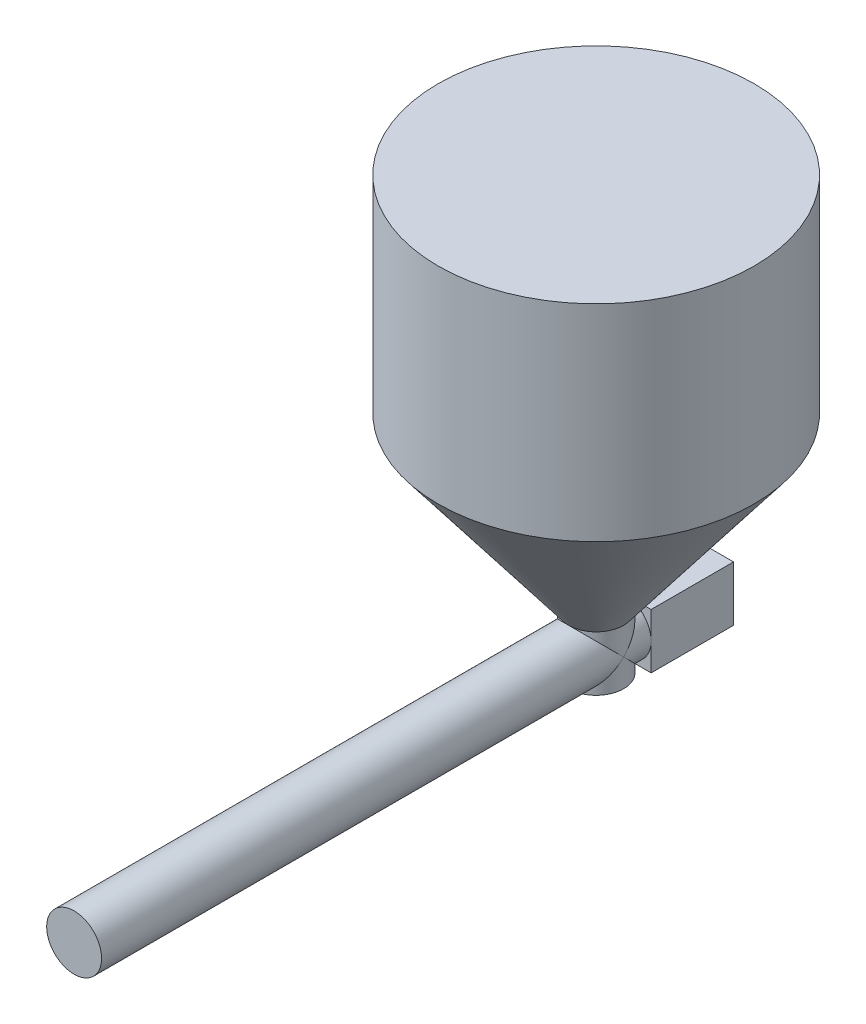
ISO-10303-21;
HEADER;
FILE_DESCRIPTION(('STEP AP214'),'2;1');
FILE_NAME('part.step','',(''),(''),'','','');
FILE_SCHEMA(('AUTOMOTIVE_DESIGN { 1 0 10303 214 1 1 1 1 }'));
ENDSEC;
DATA;
#1=APPLICATION_CONTEXT('core data for automotive mechanical design processes');
#2=APPLICATION_PROTOCOL_DEFINITION('international standard','automotive_design',2000,#1);
#3=PRODUCT_CONTEXT('',#1,'mechanical');
#4=PRODUCT('Part','Part','',(#3));
#5=PRODUCT_RELATED_PRODUCT_CATEGORY('part','',(#4));
#6=PRODUCT_DEFINITION_FORMATION('','',#4);
#7=PRODUCT_DEFINITION_CONTEXT('part definition',#1,'design');
#8=PRODUCT_DEFINITION('design','',#6,#7);
#9=PRODUCT_DEFINITION_SHAPE('','',#8);
#10=(LENGTH_UNIT() NAMED_UNIT(*) SI_UNIT(.MILLI.,.METRE.));
#11=(NAMED_UNIT(*) PLANE_ANGLE_UNIT() SI_UNIT($,.RADIAN.));
#12=(NAMED_UNIT(*) SI_UNIT($,.STERADIAN.) SOLID_ANGLE_UNIT());
#13=UNCERTAINTY_MEASURE_WITH_UNIT(LENGTH_MEASURE(1.E-05),#10,'distance_accuracy_value','');
#14=(GEOMETRIC_REPRESENTATION_CONTEXT(3) GLOBAL_UNCERTAINTY_ASSIGNED_CONTEXT((#13)) GLOBAL_UNIT_ASSIGNED_CONTEXT((#10,
#11,#12)) REPRESENTATION_CONTEXT('',''));
#15=CARTESIAN_POINT('',(0.,0.,0.));
#16=DIRECTION('',(0.,0.,1.));
#17=DIRECTION('',(1.,0.,0.));
#18=AXIS2_PLACEMENT_3D('',#15,#16,#17);
#19=CARTESIAN_POINT('',(0.,-314.,0.));
#20=DIRECTION('',(0.,1.,0.));
#21=DIRECTION('',(0.,0.,1.));
#22=AXIS2_PLACEMENT_3D('',#19,#20,#21);
#23=CYLINDRICAL_SURFACE('',#22,20.);
#24=CARTESIAN_POINT('',(0.,-294.,0.));
#25=DIRECTION('',(0.,0.707106781186547,-0.707106781186547));
#26=DIRECTION('',(0.,0.707106781186547,0.707106781186547));
#27=AXIS2_PLACEMENT_3D('',#24,#25,#26);
#28=ELLIPSE('',#27,28.2842712474619,20.);
#29=CARTESIAN_POINT('',(0.,-274.,20.));
#30=VERTEX_POINT('',#29);
#31=CARTESIAN_POINT('',(20.,-294.,0.));
#32=VERTEX_POINT('',#31);
#33=EDGE_CURVE('E207',#30,#32,#28,.T.);
#34=ORIENTED_EDGE('',*,*,#33,.T.);
#35=CARTESIAN_POINT('',(0.,-294.,0.));
#36=DIRECTION('',(0.,0.707106781186547,0.707106781186547));
#37=DIRECTION('',(0.,0.707106781186547,-0.707106781186547));
#38=AXIS2_PLACEMENT_3D('',#35,#36,#37);
#39=ELLIPSE('',#38,28.2842712474619,20.);
#40=CARTESIAN_POINT('',(0.,-274.,-20.));
#41=VERTEX_POINT('',#40);
#42=EDGE_CURVE('E202',#32,#41,#39,.T.);
#43=ORIENTED_EDGE('',*,*,#42,.T.);
#44=CARTESIAN_POINT('',(0.,-274.,0.));
#45=DIRECTION('',(0.,-1.,0.));
#46=DIRECTION('',(0.,0.,-1.));
#47=AXIS2_PLACEMENT_3D('',#44,#45,#46);
#48=CIRCLE('',#47,20.);
#49=EDGE_CURVE('E227',#41,#30,#48,.T.);
#50=ORIENTED_EDGE('',*,*,#49,.T.);
#51=EDGE_LOOP('',(#34,#43,#50));
#52=FACE_BOUND('',#51,.T.);
#53=ADVANCED_FACE('F37',(#52),#23,.T.);
#54=CARTESIAN_POINT('',(0.,-150.,0.));
#55=DIRECTION('',(0.,1.,0.));
#56=DIRECTION('',(0.,0.,1.));
#57=AXIS2_PLACEMENT_3D('',#54,#55,#56);
#58=CYLINDRICAL_SURFACE('',#57,115.);
#59=CARTESIAN_POINT('',(0.,-150.,0.));
#60=DIRECTION('',(0.,-1.,0.));
#61=DIRECTION('',(0.,0.,-1.));
#62=AXIS2_PLACEMENT_3D('',#59,#60,#61);
#63=CIRCLE('',#62,115.);
#64=CARTESIAN_POINT('',(0.,-150.,-115.));
#65=VERTEX_POINT('',#64);
#66=EDGE_CURVE('E47',#65,#65,#63,.T.);
#67=ORIENTED_EDGE('',*,*,#66,.F.);
#68=EDGE_LOOP('',(#67));
#69=FACE_BOUND('',#68,.T.);
#70=CARTESIAN_POINT('',(0.,0.,0.));
#71=DIRECTION('',(0.,1.,0.));
#72=DIRECTION('',(0.,0.,1.));
#73=AXIS2_PLACEMENT_3D('',#70,#71,#72);
#74=CIRCLE('',#73,115.);
#75=CARTESIAN_POINT('',(0.,0.,115.));
#76=VERTEX_POINT('',#75);
#77=EDGE_CURVE('E12',#76,#76,#74,.T.);
#78=ORIENTED_EDGE('',*,*,#77,.F.);
#79=EDGE_LOOP('',(#78));
#80=FACE_BOUND('',#79,.T.);
#81=ADVANCED_FACE('F39',(#69,#80),#58,.T.);
#82=CARTESIAN_POINT('',(0.,0.,0.));
#83=DIRECTION('',(0.,1.,0.));
#84=DIRECTION('',(0.,0.,1.));
#85=AXIS2_PLACEMENT_3D('',#82,#83,#84);
#86=PLANE('',#85);
#87=ORIENTED_EDGE('',*,*,#77,.T.);
#88=EDGE_LOOP('',(#87));
#89=FACE_BOUND('',#88,.T.);
#90=ADVANCED_FACE('F243',(#89),#86,.T.);
#91=CARTESIAN_POINT('',(0.,-274.,0.));
#92=DIRECTION('',(0.,1.,0.));
#93=DIRECTION('',(0.,0.,1.));
#94=AXIS2_PLACEMENT_3D('',#91,#92,#93);
#95=CONICAL_SURFACE('',#94,20.,0.65374402840699);
#96=ORIENTED_EDGE('',*,*,#49,.F.);
#97=CARTESIAN_POINT('',(0.,-274.,0.));
#98=DIRECTION('',(0.,-1.,0.));
#99=DIRECTION('',(0.,0.,1.));
#100=AXIS2_PLACEMENT_3D('',#97,#98,#99);
#101=CIRCLE('',#100,20.);
#102=EDGE_CURVE('E277',#30,#41,#101,.T.);
#103=ORIENTED_EDGE('',*,*,#102,.F.);
#104=EDGE_LOOP('',(#96,#103));
#105=FACE_BOUND('',#104,.T.);
#106=ORIENTED_EDGE('',*,*,#66,.T.);
#107=EDGE_LOOP('',(#106));
#108=FACE_BOUND('',#107,.T.);
#109=ADVANCED_FACE('F233',(#105,#108),#95,.T.);
#110=CARTESIAN_POINT('',(-20.,-294.,0.));
#111=VERTEX_POINT('',#110);
#112=EDGE_CURVE('E198',#41,#111,#39,.T.);
#113=ORIENTED_EDGE('',*,*,#112,.T.);
#114=EDGE_CURVE('E210',#111,#30,#28,.T.);
#115=ORIENTED_EDGE('',*,*,#114,.T.);
#116=ORIENTED_EDGE('',*,*,#102,.T.);
#117=EDGE_LOOP('',(#113,#115,#116));
#118=FACE_BOUND('',#117,.T.);
#119=ADVANCED_FACE('F242',(#118),#23,.T.);
#120=CARTESIAN_POINT('',(0.,-294.,380.));
#121=DIRECTION('',(0.,0.,-1.));
#122=DIRECTION('',(-1.,0.,0.));
#123=AXIS2_PLACEMENT_3D('',#120,#121,#122);
#124=PLANE('',#123);
#125=CARTESIAN_POINT('',(0.,-294.,380.));
#126=DIRECTION('',(0.,0.,-1.));
#127=DIRECTION('',(-1.,0.,0.));
#128=AXIS2_PLACEMENT_3D('',#125,#126,#127);
#129=CIRCLE('',#128,20.);
#130=CARTESIAN_POINT('',(-20.,-294.,380.));
#131=VERTEX_POINT('',#130);
#132=EDGE_CURVE('E188',#131,#131,#129,.T.);
#133=ORIENTED_EDGE('',*,*,#132,.F.);
#134=EDGE_LOOP('',(#133));
#135=FACE_BOUND('',#134,.T.);
#136=ADVANCED_FACE('F268',(#135),#124,.F.);
#137=CARTESIAN_POINT('',(0.,-294.,380.));
#138=DIRECTION('',(0.,0.,-1.));
#139=DIRECTION('',(-1.,0.,0.));
#140=AXIS2_PLACEMENT_3D('',#137,#138,#139);
#141=CYLINDRICAL_SURFACE('',#140,20.);
#142=ORIENTED_EDGE('',*,*,#132,.T.);
#143=EDGE_LOOP('',(#142));
#144=FACE_BOUND('',#143,.T.);
#145=CARTESIAN_POINT('',(0.,-294.,0.));
#146=DIRECTION('',(0.,0.707106781186547,0.707106781186547));
#147=DIRECTION('',(0.,0.707106781186547,-0.707106781186547));
#148=AXIS2_PLACEMENT_3D('',#145,#146,#147);
#149=ELLIPSE('',#148,28.2842712474619,20.);
#150=CARTESIAN_POINT('',(0.,-314.,20.));
#151=VERTEX_POINT('',#150);
#152=EDGE_CURVE('E199',#32,#151,#149,.F.);
#153=ORIENTED_EDGE('',*,*,#152,.F.);
#154=ORIENTED_EDGE('',*,*,#33,.F.);
#155=ORIENTED_EDGE('',*,*,#114,.F.);
#156=EDGE_CURVE('E63',#151,#111,#149,.F.);
#157=ORIENTED_EDGE('',*,*,#156,.F.);
#158=EDGE_LOOP('',(#153,#154,#155,#157));
#159=FACE_BOUND('',#158,.T.);
#160=ADVANCED_FACE('F273',(#144,#159),#141,.T.);
#161=CARTESIAN_POINT('',(0.,-294.,0.));
#162=DIRECTION('',(0.,0.707106781186547,-0.707106781186547));
#163=DIRECTION('',(0.,0.707106781186547,0.707106781186547));
#164=AXIS2_PLACEMENT_3D('',#161,#162,#163);
#165=ELLIPSE('',#164,28.2842712474619,20.);
#166=CARTESIAN_POINT('',(0.,-314.,-20.));
#167=VERTEX_POINT('',#166);
#168=EDGE_CURVE('E219',#111,#167,#165,.F.);
#169=ORIENTED_EDGE('',*,*,#168,.F.);
#170=ORIENTED_EDGE('',*,*,#112,.F.);
#171=CARTESIAN_POINT('',(0.,-294.,-20.));
#172=DIRECTION('',(0.,0.,-1.));
#173=DIRECTION('',(-1.,0.,0.));
#174=AXIS2_PLACEMENT_3D('',#171,#172,#173);
#175=CIRCLE('',#174,20.);
#176=CARTESIAN_POINT('',(-20.,-294.,-20.));
#177=VERTEX_POINT('',#176);
#178=EDGE_CURVE('E55',#41,#177,#175,.F.);
#179=ORIENTED_EDGE('',*,*,#178,.T.);
#180=CARTESIAN_POINT('',(0.,-294.,-20.));
#181=DIRECTION('',(0.,0.,-1.));
#182=DIRECTION('',(-1.,0.,0.));
#183=AXIS2_PLACEMENT_3D('',#180,#181,#182);
#184=CIRCLE('',#183,20.);
#185=EDGE_CURVE('E176',#167,#177,#184,.T.);
#186=ORIENTED_EDGE('',*,*,#185,.F.);
#187=EDGE_LOOP('',(#169,#170,#179,#186));
#188=FACE_BOUND('',#187,.T.);
#189=ADVANCED_FACE('F278',(#188),#141,.T.);
#190=EDGE_CURVE('E216',#167,#32,#165,.F.);
#191=ORIENTED_EDGE('',*,*,#190,.F.);
#192=CARTESIAN_POINT('',(0.,-294.,-20.));
#193=DIRECTION('',(0.,0.,-1.));
#194=DIRECTION('',(-1.,0.,0.));
#195=AXIS2_PLACEMENT_3D('',#192,#193,#194);
#196=CIRCLE('',#195,20.);
#197=CARTESIAN_POINT('',(20.,-294.,-20.));
#198=VERTEX_POINT('',#197);
#199=EDGE_CURVE('E134',#167,#198,#196,.F.);
#200=ORIENTED_EDGE('',*,*,#199,.T.);
#201=EDGE_CURVE('E178',#41,#198,#184,.T.);
#202=ORIENTED_EDGE('',*,*,#201,.F.);
#203=ORIENTED_EDGE('',*,*,#42,.F.);
#204=EDGE_LOOP('',(#191,#200,#202,#203));
#205=FACE_BOUND('',#204,.T.);
#206=ADVANCED_FACE('F265',(#205),#141,.T.);
#207=CARTESIAN_POINT('',(0.,-314.,0.));
#208=DIRECTION('',(0.,-1.,0.));
#209=DIRECTION('',(0.,0.,-1.));
#210=AXIS2_PLACEMENT_3D('',#207,#208,#209);
#211=PLANE('',#210);
#212=CARTESIAN_POINT('',(0.,-314.,0.));
#213=DIRECTION('',(0.,-1.,0.));
#214=DIRECTION('',(0.,0.,-1.));
#215=AXIS2_PLACEMENT_3D('',#212,#213,#214);
#216=CIRCLE('',#215,20.);
#217=EDGE_CURVE('E223',#151,#167,#216,.T.);
#218=ORIENTED_EDGE('',*,*,#217,.T.);
#219=EDGE_CURVE('E220',#167,#151,#216,.T.);
#220=ORIENTED_EDGE('',*,*,#219,.T.);
#221=EDGE_LOOP('',(#218,#220));
#222=FACE_BOUND('',#221,.T.);
#223=ADVANCED_FACE('F261',(#222),#211,.T.);
#224=ORIENTED_EDGE('',*,*,#156,.T.);
#225=ORIENTED_EDGE('',*,*,#168,.T.);
#226=ORIENTED_EDGE('',*,*,#217,.F.);
#227=EDGE_LOOP('',(#224,#225,#226));
#228=FACE_BOUND('',#227,.T.);
#229=ADVANCED_FACE('F255',(#228),#23,.T.);
#230=ORIENTED_EDGE('',*,*,#190,.T.);
#231=ORIENTED_EDGE('',*,*,#152,.T.);
#232=ORIENTED_EDGE('',*,*,#219,.F.);
#233=EDGE_LOOP('',(#230,#231,#232));
#234=FACE_BOUND('',#233,.T.);
#235=ADVANCED_FACE('F254',(#234),#23,.T.);
#236=CARTESIAN_POINT('',(0.,0.,-20.));
#237=DIRECTION('',(0.,0.,-1.));
#238=DIRECTION('',(-1.,0.,0.));
#239=AXIS2_PLACEMENT_3D('',#236,#237,#238);
#240=PLANE('',#239);
#241=ORIENTED_EDGE('',*,*,#185,.T.);
#242=DIRECTION('',(0.,1.,0.));
#243=VECTOR('',#242,1.);
#244=CARTESIAN_POINT('',(-20.,-274.,-20.));
#245=LINE('',#244,#243);
#246=CARTESIAN_POINT('',(-20.,-314.,-20.));
#247=VERTEX_POINT('',#246);
#248=EDGE_CURVE('E145',#247,#177,#245,.T.);
#249=ORIENTED_EDGE('',*,*,#248,.F.);
#250=DIRECTION('',(-1.,0.,0.));
#251=VECTOR('',#250,1.);
#252=CARTESIAN_POINT('',(20.,-314.,-20.));
#253=LINE('',#252,#251);
#254=EDGE_CURVE('E154',#167,#247,#253,.T.);
#255=ORIENTED_EDGE('',*,*,#254,.F.);
#256=EDGE_LOOP('',(#241,#249,#255));
#257=FACE_BOUND('',#256,.T.);
#258=ADVANCED_FACE('F175',(#257),#240,.F.);
#259=ORIENTED_EDGE('',*,*,#178,.F.);
#260=DIRECTION('',(1.,0.,0.));
#261=VECTOR('',#260,1.);
#262=CARTESIAN_POINT('',(20.,-274.,-20.));
#263=LINE('',#262,#261);
#264=CARTESIAN_POINT('',(-20.,-274.,-20.));
#265=VERTEX_POINT('',#264);
#266=EDGE_CURVE('E144',#265,#41,#263,.T.);
#267=ORIENTED_EDGE('',*,*,#266,.F.);
#268=EDGE_CURVE('E132',#177,#265,#245,.T.);
#269=ORIENTED_EDGE('',*,*,#268,.F.);
#270=EDGE_LOOP('',(#259,#267,#269));
#271=FACE_BOUND('',#270,.T.);
#272=ADVANCED_FACE('F181',(#271),#240,.F.);
#273=ORIENTED_EDGE('',*,*,#199,.F.);
#274=CARTESIAN_POINT('',(20.,-314.,-20.));
#275=VERTEX_POINT('',#274);
#276=EDGE_CURVE('E127',#275,#167,#253,.T.);
#277=ORIENTED_EDGE('',*,*,#276,.F.);
#278=DIRECTION('',(0.,-1.,0.));
#279=VECTOR('',#278,1.);
#280=CARTESIAN_POINT('',(20.,-274.,-20.));
#281=LINE('',#280,#279);
#282=EDGE_CURVE('E155',#198,#275,#281,.T.);
#283=ORIENTED_EDGE('',*,*,#282,.F.);
#284=EDGE_LOOP('',(#273,#277,#283));
#285=FACE_BOUND('',#284,.T.);
#286=ADVANCED_FACE('F168',(#285),#240,.F.);
#287=CARTESIAN_POINT('',(-20.,-274.,-80.));
#288=DIRECTION('',(1.,0.,0.));
#289=DIRECTION('',(0.,1.,0.));
#290=AXIS2_PLACEMENT_3D('',#287,#288,#289);
#291=PLANE('',#290);
#292=ORIENTED_EDGE('',*,*,#248,.T.);
#293=ORIENTED_EDGE('',*,*,#268,.T.);
#294=DIRECTION('',(0.,0.,1.));
#295=VECTOR('',#294,1.);
#296=CARTESIAN_POINT('',(-20.,-274.,-80.));
#297=LINE('',#296,#295);
#298=CARTESIAN_POINT('',(-20.,-274.,-80.));
#299=VERTEX_POINT('',#298);
#300=EDGE_CURVE('E112',#299,#265,#297,.T.);
#301=ORIENTED_EDGE('',*,*,#300,.F.);
#302=DIRECTION('',(0.,1.,0.));
#303=VECTOR('',#302,1.);
#304=CARTESIAN_POINT('',(-20.,-274.,-80.));
#305=LINE('',#304,#303);
#306=CARTESIAN_POINT('',(-20.,-314.,-80.));
#307=VERTEX_POINT('',#306);
#308=EDGE_CURVE('E118',#307,#299,#305,.T.);
#309=ORIENTED_EDGE('',*,*,#308,.F.);
#310=DIRECTION('',(0.,0.,1.));
#311=VECTOR('',#310,1.);
#312=CARTESIAN_POINT('',(-20.,-314.,-80.));
#313=LINE('',#312,#311);
#314=EDGE_CURVE('E158',#307,#247,#313,.T.);
#315=ORIENTED_EDGE('',*,*,#314,.T.);
#316=EDGE_LOOP('',(#292,#293,#301,#309,#315));
#317=FACE_BOUND('',#316,.T.);
#318=ADVANCED_FACE('F130',(#317),#291,.F.);
#319=CARTESIAN_POINT('',(20.,-274.,-80.));
#320=DIRECTION('',(0.,-1.,0.));
#321=DIRECTION('',(0.,0.,-1.));
#322=AXIS2_PLACEMENT_3D('',#319,#320,#321);
#323=PLANE('',#322);
#324=ORIENTED_EDGE('',*,*,#266,.T.);
#325=CARTESIAN_POINT('',(20.,-274.,-20.));
#326=VERTEX_POINT('',#325);
#327=EDGE_CURVE('E141',#41,#326,#263,.T.);
#328=ORIENTED_EDGE('',*,*,#327,.T.);
#329=DIRECTION('',(0.,0.,1.));
#330=VECTOR('',#329,1.);
#331=CARTESIAN_POINT('',(20.,-274.,-80.));
#332=LINE('',#331,#330);
#333=CARTESIAN_POINT('',(20.,-274.,-80.));
#334=VERTEX_POINT('',#333);
#335=EDGE_CURVE('E114',#334,#326,#332,.T.);
#336=ORIENTED_EDGE('',*,*,#335,.F.);
#337=DIRECTION('',(1.,0.,0.));
#338=VECTOR('',#337,1.);
#339=CARTESIAN_POINT('',(20.,-274.,-80.));
#340=LINE('',#339,#338);
#341=EDGE_CURVE('E107',#299,#334,#340,.T.);
#342=ORIENTED_EDGE('',*,*,#341,.F.);
#343=ORIENTED_EDGE('',*,*,#300,.T.);
#344=EDGE_LOOP('',(#324,#328,#336,#342,#343));
#345=FACE_BOUND('',#344,.T.);
#346=ADVANCED_FACE('F110',(#345),#323,.F.);
#347=CARTESIAN_POINT('',(20.,-274.,-80.));
#348=DIRECTION('',(-1.,0.,0.));
#349=DIRECTION('',(0.,-1.,0.));
#350=AXIS2_PLACEMENT_3D('',#347,#348,#349);
#351=PLANE('',#350);
#352=EDGE_CURVE('E150',#326,#198,#281,.T.);
#353=ORIENTED_EDGE('',*,*,#352,.T.);
#354=ORIENTED_EDGE('',*,*,#282,.T.);
#355=DIRECTION('',(0.,0.,1.));
#356=VECTOR('',#355,1.);
#357=CARTESIAN_POINT('',(20.,-314.,-80.));
#358=LINE('',#357,#356);
#359=CARTESIAN_POINT('',(20.,-314.,-80.));
#360=VERTEX_POINT('',#359);
#361=EDGE_CURVE('E137',#360,#275,#358,.T.);
#362=ORIENTED_EDGE('',*,*,#361,.F.);
#363=DIRECTION('',(0.,-1.,0.));
#364=VECTOR('',#363,1.);
#365=CARTESIAN_POINT('',(20.,-274.,-80.));
#366=LINE('',#365,#364);
#367=EDGE_CURVE('E117',#334,#360,#366,.T.);
#368=ORIENTED_EDGE('',*,*,#367,.F.);
#369=ORIENTED_EDGE('',*,*,#335,.T.);
#370=EDGE_LOOP('',(#353,#354,#362,#368,#369));
#371=FACE_BOUND('',#370,.T.);
#372=ADVANCED_FACE('F183',(#371),#351,.F.);
#373=CARTESIAN_POINT('',(20.,-314.,-80.));
#374=DIRECTION('',(0.,1.,0.));
#375=DIRECTION('',(0.,0.,1.));
#376=AXIS2_PLACEMENT_3D('',#373,#374,#375);
#377=PLANE('',#376);
#378=ORIENTED_EDGE('',*,*,#276,.T.);
#379=ORIENTED_EDGE('',*,*,#254,.T.);
#380=ORIENTED_EDGE('',*,*,#314,.F.);
#381=DIRECTION('',(-1.,0.,0.));
#382=VECTOR('',#381,1.);
#383=CARTESIAN_POINT('',(20.,-314.,-80.));
#384=LINE('',#383,#382);
#385=EDGE_CURVE('E123',#360,#307,#384,.T.);
#386=ORIENTED_EDGE('',*,*,#385,.F.);
#387=ORIENTED_EDGE('',*,*,#361,.T.);
#388=EDGE_LOOP('',(#378,#379,#380,#386,#387));
#389=FACE_BOUND('',#388,.T.);
#390=ADVANCED_FACE('F163',(#389),#377,.F.);
#391=CARTESIAN_POINT('',(0.,0.,-80.));
#392=DIRECTION('',(0.,0.,-1.));
#393=DIRECTION('',(-1.,0.,0.));
#394=AXIS2_PLACEMENT_3D('',#391,#392,#393);
#395=PLANE('',#394);
#396=ORIENTED_EDGE('',*,*,#308,.T.);
#397=ORIENTED_EDGE('',*,*,#341,.T.);
#398=ORIENTED_EDGE('',*,*,#367,.T.);
#399=ORIENTED_EDGE('',*,*,#385,.T.);
#400=EDGE_LOOP('',(#396,#397,#398,#399));
#401=FACE_BOUND('',#400,.T.);
#402=ADVANCED_FACE('F121',(#401),#395,.T.);
#403=ORIENTED_EDGE('',*,*,#201,.T.);
#404=ORIENTED_EDGE('',*,*,#352,.F.);
#405=ORIENTED_EDGE('',*,*,#327,.F.);
#406=EDGE_LOOP('',(#403,#404,#405));
#407=FACE_BOUND('',#406,.T.);
#408=ADVANCED_FACE('F186',(#407),#240,.F.);
#409=CLOSED_SHELL('',(#53,#81,#90,#109,#119,#136,#160,#189,#206,#223,#229,#235,#258,#272,#286,
#318,#346,#372,#390,#402,#408));
#410=MANIFOLD_SOLID_BREP('B2',#409);
#411=ADVANCED_BREP_SHAPE_REPRESENTATION('',(#18,#410),#14);
#412=SHAPE_DEFINITION_REPRESENTATION(#9,#411);
ENDSEC;
END-ISO-10303-21;
